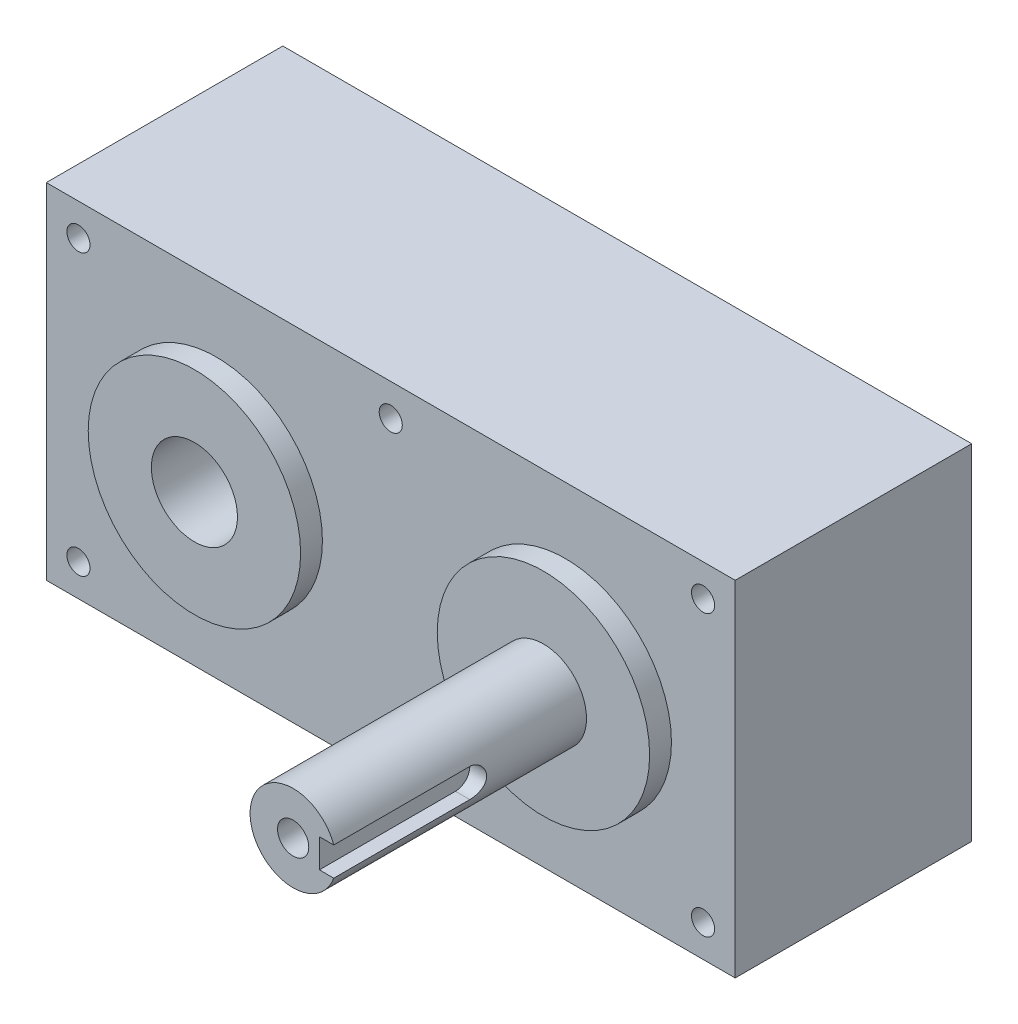
ISO-10303-21;
HEADER;
FILE_DESCRIPTION(('STEP AP214'),'2;1');
FILE_NAME('part.step','',(''),(''),'','','');
FILE_SCHEMA(('AUTOMOTIVE_DESIGN { 1 0 10303 214 1 1 1 1 }'));
ENDSEC;
DATA;
#1=APPLICATION_CONTEXT('core data for automotive mechanical design processes');
#2=APPLICATION_PROTOCOL_DEFINITION('international standard','automotive_design',2000,#1);
#3=PRODUCT_CONTEXT('',#1,'mechanical');
#4=PRODUCT('Part','Part','',(#3));
#5=PRODUCT_RELATED_PRODUCT_CATEGORY('part','',(#4));
#6=PRODUCT_DEFINITION_FORMATION('','',#4);
#7=PRODUCT_DEFINITION_CONTEXT('part definition',#1,'design');
#8=PRODUCT_DEFINITION('design','',#6,#7);
#9=PRODUCT_DEFINITION_SHAPE('','',#8);
#10=(LENGTH_UNIT() NAMED_UNIT(*) SI_UNIT(.MILLI.,.METRE.));
#11=(NAMED_UNIT(*) PLANE_ANGLE_UNIT() SI_UNIT($,.RADIAN.));
#12=(NAMED_UNIT(*) SI_UNIT($,.STERADIAN.) SOLID_ANGLE_UNIT());
#13=UNCERTAINTY_MEASURE_WITH_UNIT(LENGTH_MEASURE(1.E-05),#10,'distance_accuracy_value','');
#14=(GEOMETRIC_REPRESENTATION_CONTEXT(3) GLOBAL_UNCERTAINTY_ASSIGNED_CONTEXT((#13)) GLOBAL_UNIT_ASSIGNED_CONTEXT((#10,
#11,#12)) REPRESENTATION_CONTEXT('',''));
#15=CARTESIAN_POINT('',(0.,0.,0.));
#16=DIRECTION('',(0.,0.,1.));
#17=DIRECTION('',(1.,0.,0.));
#18=AXIS2_PLACEMENT_3D('',#15,#16,#17);
#19=CARTESIAN_POINT('',(120.613256121069,38.1,82.423));
#20=DIRECTION('',(-1.,0.,0.));
#21=DIRECTION('',(0.,-1.,0.));
#22=AXIS2_PLACEMENT_3D('',#19,#20,#21);
#23=CYLINDRICAL_SURFACE('',#22,3.175);
#24=DIRECTION('',(-1.,0.,0.));
#25=VECTOR('',#24,1.);
#26=CARTESIAN_POINT('',(120.613256121069,41.275,82.423));
#27=LINE('',#26,#25);
#28=CARTESIAN_POINT('',(120.613256121069,41.275,82.423));
#29=VERTEX_POINT('',#28);
#30=CARTESIAN_POINT('',(123.788256121069,41.275,82.423));
#31=VERTEX_POINT('',#30);
#32=EDGE_CURVE('E238',#29,#31,#27,.F.);
#33=ORIENTED_EDGE('',*,*,#32,.F.);
#34=CARTESIAN_POINT('',(120.613256121069,38.1,82.423));
#35=DIRECTION('',(-1.,0.,0.));
#36=DIRECTION('',(0.,0.,1.));
#37=AXIS2_PLACEMENT_3D('',#34,#35,#36);
#38=CIRCLE('',#37,3.175);
#39=CARTESIAN_POINT('',(120.613256121069,34.925,82.423));
#40=VERTEX_POINT('',#39);
#41=EDGE_CURVE('E45',#40,#29,#38,.F.);
#42=ORIENTED_EDGE('',*,*,#41,.F.);
#43=DIRECTION('',(-1.,0.,0.));
#44=VECTOR('',#43,1.);
#45=CARTESIAN_POINT('',(120.613256121069,34.925,82.423));
#46=LINE('',#45,#44);
#47=CARTESIAN_POINT('',(123.788256121069,34.925,82.423));
#48=VERTEX_POINT('',#47);
#49=EDGE_CURVE('E243',#48,#40,#46,.T.);
#50=ORIENTED_EDGE('',*,*,#49,.F.);
#51=CARTESIAN_POINT('',(123.788256121069,41.275,82.423));
#52=CARTESIAN_POINT('',(123.788242304569,41.2750114187021,82.3363770111682));
#53=CARTESIAN_POINT('',(123.789509137588,41.2714552677141,82.2497617451623));
#54=CARTESIAN_POINT('',(123.794501256337,41.257296781412,82.0772030812965));
#55=CARTESIAN_POINT('',(123.798225878423,41.2466963481645,81.9912595084052));
#56=CARTESIAN_POINT('',(123.808016356707,41.2185797346695,81.8209050797898));
#57=CARTESIAN_POINT('',(123.814075267596,41.2010840665918,81.7364904477605));
#58=CARTESIAN_POINT('',(123.828335272806,41.1593560990825,81.5695494988998));
#59=CARTESIAN_POINT('',(123.836536444546,41.1351235561826,81.4870232504307));
#60=CARTESIAN_POINT('',(123.863988248083,41.0526427015886,81.2432187937627));
#61=CARTESIAN_POINT('',(123.886102797327,40.9845689934899,81.0854624700145));
#62=CARTESIAN_POINT('',(123.935452332912,40.8243758581497,80.7835864494401));
#63=CARTESIAN_POINT('',(123.962690460599,40.7322416655113,80.6394752005539));
#64=CARTESIAN_POINT('',(124.020404516346,40.5226900472536,80.3633230125976));
#65=CARTESIAN_POINT('',(124.050960805736,40.4044948148077,80.2318878687051));
#66=CARTESIAN_POINT('',(124.111189759421,40.1478378041234,79.9902932788725));
#67=CARTESIAN_POINT('',(124.140862265577,40.0093724247679,79.8801376214474));
#68=CARTESIAN_POINT('',(124.196915767422,39.7116417156586,79.6814532552662));
#69=CARTESIAN_POINT('',(124.223190637862,39.5519278210567,79.5935640694678));
#70=CARTESIAN_POINT('',(124.268535077923,39.2189628313095,79.4461444060076));
#71=CARTESIAN_POINT('',(124.287606848253,39.0457158903656,79.3866052653225));
#72=CARTESIAN_POINT('',(124.315825507567,38.6969931812008,79.2996391202349));
#73=CARTESIAN_POINT('',(124.32529455999,38.5218045762153,79.2711671268605));
#74=CARTESIAN_POINT('',(124.334384567219,38.1688942262177,79.2438207349669));
#75=CARTESIAN_POINT('',(124.334007868601,37.9911730948842,79.2449392840205));
#76=CARTESIAN_POINT('',(124.323666726315,37.6456452892315,79.2760806164439));
#77=CARTESIAN_POINT('',(124.314078935449,37.4777231596305,79.3049679285731));
#78=CARTESIAN_POINT('',(124.286865996925,37.1492651051381,79.3889483527356));
#79=CARTESIAN_POINT('',(124.269240403605,36.9887295903482,79.4440429178623));
#80=CARTESIAN_POINT('',(124.227452463823,36.677115385271,79.5795380456848));
#81=CARTESIAN_POINT('',(124.203207187155,36.5261888569493,79.6602619328026));
#82=CARTESIAN_POINT('',(124.150703823057,36.2396895672522,79.844454605925));
#83=CARTESIAN_POINT('',(124.1224446448,36.1041209976522,79.947929579018));
#84=CARTESIAN_POINT('',(124.063324078611,35.8454404082646,80.1804084756018));
#85=CARTESIAN_POINT('',(124.032402811162,35.7232132308154,80.3103836293183));
#86=CARTESIAN_POINT('',(123.972558034507,35.5019883741715,80.5892406979345));
#87=CARTESIAN_POINT('',(123.943635172829,35.402998199621,80.7381286970844));
#88=CARTESIAN_POINT('',(123.890722691995,35.229781653216,81.0536014161336));
#89=CARTESIAN_POINT('',(123.86681220235,35.155942426803,81.2204149349338));
#90=CARTESIAN_POINT('',(123.837366533237,35.0673266974343,81.4786323757371));
#91=CARTESIAN_POINT('',(123.828622289333,35.0414812244401,81.566021734566));
#92=CARTESIAN_POINT('',(123.813543686305,34.9973630222442,81.7428836693226));
#93=CARTESIAN_POINT('',(123.80720822687,34.9790868351194,81.8323552742307));
#94=CARTESIAN_POINT('',(123.797590875591,34.9514947824257,82.0052052189527));
#95=CARTESIAN_POINT('',(123.794099529513,34.9415621417742,82.0884744441732));
#96=CARTESIAN_POINT('',(123.789427761841,34.9283143888059,82.2554928520594));
#97=CARTESIAN_POINT('',(123.788244358315,34.9249907373681,82.3392412750043));
#98=CARTESIAN_POINT('',(123.788256121069,34.925,82.423));
#99=B_SPLINE_CURVE_WITH_KNOTS('',3,(#51,#52,#53,#54,#55,#56,#57,#58,#59,#60,#61,#62,#63,#64,#65,
#66,#67,#68,#69,#70,#71,#72,#73,#74,#75,#76,#77,#78,#79,#80,#81,#82,#83,#84,#85,#86,#87,#88,#89,
#90,#91,#92,#93,#94,#95,#96,#97,#98),.UNSPECIFIED.,.F.,.F.,(4,2,2,2,2,2,2,2,2,2,2,2,2,2,2,2,2,2,
2,2,2,2,2,4),(0.,0.259773689035002,0.51947726358803,0.778414025374909,1.03736014626284,
1.55449291492534,2.07194378556215,2.60766387392255,3.14347925203152,3.6932798119835,
4.24291225945331,4.77342553695256,5.30381237633042,5.81339512764462,6.32300613669439,
6.839320189082,7.35577482555092,7.89650105770063,8.43740168377097,8.98628729157281,
9.26063415404912,9.53485554636032,9.78636405546807,10.0375473922007),.UNSPECIFIED.);
#100=EDGE_CURVE('E11',#48,#31,#99,.F.);
#101=ORIENTED_EDGE('',*,*,#100,.T.);
#102=EDGE_LOOP('',(#33,#42,#50,#101));
#103=FACE_BOUND('',#102,.T.);
#104=ADVANCED_FACE('F33',(#103),#23,.F.);
#105=CARTESIAN_POINT('',(114.808,38.1,57.15));
#106=DIRECTION('',(0.,0.,1.));
#107=DIRECTION('',(1.,0.,0.));
#108=AXIS2_PLACEMENT_3D('',#105,#106,#107);
#109=PLANE('',#108);
#110=CARTESIAN_POINT('',(114.808,38.1,57.15));
#111=DIRECTION('',(0.,0.,1.));
#112=DIRECTION('',(1.,0.,0.));
#113=AXIS2_PLACEMENT_3D('',#110,#111,#112);
#114=CIRCLE('',#113,23.495);
#115=CARTESIAN_POINT('',(138.303,38.1,57.15));
#116=VERTEX_POINT('',#115);
#117=EDGE_CURVE('E160',#116,#116,#114,.T.);
#118=ORIENTED_EDGE('',*,*,#117,.T.);
#119=EDGE_LOOP('',(#118));
#120=FACE_BOUND('',#119,.T.);
#121=CARTESIAN_POINT('',(114.808,38.1,57.15));
#122=DIRECTION('',(0.,0.,1.));
#123=DIRECTION('',(1.,0.,0.));
#124=AXIS2_PLACEMENT_3D('',#121,#122,#123);
#125=CIRCLE('',#124,9.52500000000001);
#126=CARTESIAN_POINT('',(124.333,38.1,57.15));
#127=VERTEX_POINT('',#126);
#128=EDGE_CURVE('E159',#127,#127,#125,.F.);
#129=ORIENTED_EDGE('',*,*,#128,.T.);
#130=EDGE_LOOP('',(#129));
#131=FACE_BOUND('',#130,.T.);
#132=ADVANCED_FACE('F265',(#120,#131),#109,.T.);
#133=CARTESIAN_POINT('',(0.,76.2,52.324));
#134=DIRECTION('',(0.,0.,-1.));
#135=DIRECTION('',(-1.,0.,0.));
#136=AXIS2_PLACEMENT_3D('',#133,#134,#135);
#137=PLANE('',#136);
#138=CARTESIAN_POINT('',(37.592,38.1,52.324));
#139=DIRECTION('',(0.,0.,-1.));
#140=DIRECTION('',(-1.,0.,0.));
#141=AXIS2_PLACEMENT_3D('',#138,#139,#140);
#142=CIRCLE('',#141,23.495);
#143=CARTESIAN_POINT('',(14.097,38.1,52.324));
#144=VERTEX_POINT('',#143);
#145=EDGE_CURVE('E232',#144,#144,#142,.F.);
#146=ORIENTED_EDGE('',*,*,#145,.F.);
#147=EDGE_LOOP('',(#146));
#148=FACE_BOUND('',#147,.T.);
#149=CARTESIAN_POINT('',(76.2,7.11199999999999,52.324));
#150=DIRECTION('',(0.,0.,1.));
#151=DIRECTION('',(1.,0.,0.));
#152=AXIS2_PLACEMENT_3D('',#149,#150,#151);
#153=CIRCLE('',#152,2.55270000000001);
#154=CARTESIAN_POINT('',(78.7527,7.11199999999999,52.324));
#155=VERTEX_POINT('',#154);
#156=EDGE_CURVE('E166',#155,#155,#153,.T.);
#157=ORIENTED_EDGE('',*,*,#156,.F.);
#158=EDGE_LOOP('',(#157));
#159=FACE_BOUND('',#158,.T.);
#160=CARTESIAN_POINT('',(7.11200000000001,7.11199999999999,52.324));
#161=DIRECTION('',(0.,0.,1.));
#162=DIRECTION('',(1.,0.,0.));
#163=AXIS2_PLACEMENT_3D('',#160,#161,#162);
#164=CIRCLE('',#163,2.5527);
#165=CARTESIAN_POINT('',(9.66470000000001,7.11199999999999,52.324));
#166=VERTEX_POINT('',#165);
#167=EDGE_CURVE('E172',#166,#166,#164,.T.);
#168=ORIENTED_EDGE('',*,*,#167,.F.);
#169=EDGE_LOOP('',(#168));
#170=FACE_BOUND('',#169,.T.);
#171=CARTESIAN_POINT('',(145.288,7.11199999999999,52.324));
#172=DIRECTION('',(0.,0.,1.));
#173=DIRECTION('',(1.,0.,0.));
#174=AXIS2_PLACEMENT_3D('',#171,#172,#173);
#175=CIRCLE('',#174,2.55269999999999);
#176=CARTESIAN_POINT('',(147.8407,7.11199999999999,52.324));
#177=VERTEX_POINT('',#176);
#178=EDGE_CURVE('E178',#177,#177,#175,.T.);
#179=ORIENTED_EDGE('',*,*,#178,.F.);
#180=EDGE_LOOP('',(#179));
#181=FACE_BOUND('',#180,.T.);
#182=CARTESIAN_POINT('',(76.2,69.088,52.324));
#183=DIRECTION('',(0.,0.,1.));
#184=DIRECTION('',(1.,0.,0.));
#185=AXIS2_PLACEMENT_3D('',#182,#183,#184);
#186=CIRCLE('',#185,2.55270000000001);
#187=CARTESIAN_POINT('',(78.7527,69.088,52.324));
#188=VERTEX_POINT('',#187);
#189=EDGE_CURVE('E184',#188,#188,#186,.T.);
#190=ORIENTED_EDGE('',*,*,#189,.F.);
#191=EDGE_LOOP('',(#190));
#192=FACE_BOUND('',#191,.T.);
#193=CARTESIAN_POINT('',(7.11200000000001,69.088,52.324));
#194=DIRECTION('',(0.,0.,1.));
#195=DIRECTION('',(1.,0.,0.));
#196=AXIS2_PLACEMENT_3D('',#193,#194,#195);
#197=CIRCLE('',#196,2.5527);
#198=CARTESIAN_POINT('',(9.66470000000001,69.088,52.324));
#199=VERTEX_POINT('',#198);
#200=EDGE_CURVE('E190',#199,#199,#197,.T.);
#201=ORIENTED_EDGE('',*,*,#200,.F.);
#202=EDGE_LOOP('',(#201));
#203=FACE_BOUND('',#202,.T.);
#204=CARTESIAN_POINT('',(145.288,69.088,52.324));
#205=DIRECTION('',(0.,0.,1.));
#206=DIRECTION('',(1.,0.,0.));
#207=AXIS2_PLACEMENT_3D('',#204,#205,#206);
#208=CIRCLE('',#207,2.55269999999999);
#209=CARTESIAN_POINT('',(147.8407,69.088,52.324));
#210=VERTEX_POINT('',#209);
#211=EDGE_CURVE('E196',#210,#210,#208,.T.);
#212=ORIENTED_EDGE('',*,*,#211,.F.);
#213=EDGE_LOOP('',(#212));
#214=FACE_BOUND('',#213,.T.);
#215=DIRECTION('',(0.,-1.,0.));
#216=VECTOR('',#215,1.);
#217=CARTESIAN_POINT('',(0.,0.,52.324));
#218=LINE('',#217,#216);
#219=CARTESIAN_POINT('',(0.,76.2,52.324));
#220=VERTEX_POINT('',#219);
#221=CARTESIAN_POINT('',(0.,0.,52.324));
#222=VERTEX_POINT('',#221);
#223=EDGE_CURVE('E203',#220,#222,#218,.T.);
#224=ORIENTED_EDGE('',*,*,#223,.T.);
#225=DIRECTION('',(1.,0.,0.));
#226=VECTOR('',#225,1.);
#227=CARTESIAN_POINT('',(0.,0.,52.324));
#228=LINE('',#227,#226);
#229=CARTESIAN_POINT('',(152.4,0.,52.324));
#230=VERTEX_POINT('',#229);
#231=EDGE_CURVE('E206',#222,#230,#228,.T.);
#232=ORIENTED_EDGE('',*,*,#231,.T.);
#233=DIRECTION('',(0.,1.,0.));
#234=VECTOR('',#233,1.);
#235=CARTESIAN_POINT('',(152.4,0.,52.324));
#236=LINE('',#235,#234);
#237=CARTESIAN_POINT('',(152.4,76.2,52.324));
#238=VERTEX_POINT('',#237);
#239=EDGE_CURVE('E209',#230,#238,#236,.T.);
#240=ORIENTED_EDGE('',*,*,#239,.T.);
#241=DIRECTION('',(-1.,0.,0.));
#242=VECTOR('',#241,1.);
#243=CARTESIAN_POINT('',(0.,76.2,52.324));
#244=LINE('',#243,#242);
#245=EDGE_CURVE('E211',#238,#220,#244,.T.);
#246=ORIENTED_EDGE('',*,*,#245,.T.);
#247=EDGE_LOOP('',(#224,#232,#240,#246));
#248=FACE_BOUND('',#247,.T.);
#249=CARTESIAN_POINT('',(114.808,38.1,52.324));
#250=DIRECTION('',(0.,0.,-1.));
#251=DIRECTION('',(-1.,0.,0.));
#252=AXIS2_PLACEMENT_3D('',#249,#250,#251);
#253=CIRCLE('',#252,23.495);
#254=CARTESIAN_POINT('',(91.313,38.1,52.324));
#255=VERTEX_POINT('',#254);
#256=EDGE_CURVE('E235',#255,#255,#253,.F.);
#257=ORIENTED_EDGE('',*,*,#256,.F.);
#258=EDGE_LOOP('',(#257));
#259=FACE_BOUND('',#258,.T.);
#260=ADVANCED_FACE('F267',(#148,#159,#170,#181,#192,#203,#214,#248,#259),#137,.F.);
#261=CARTESIAN_POINT('',(0.,0.,52.324));
#262=DIRECTION('',(1.,0.,0.));
#263=DIRECTION('',(0.,0.,-1.));
#264=AXIS2_PLACEMENT_3D('',#261,#262,#263);
#265=PLANE('',#264);
#266=DIRECTION('',(0.,-1.,0.));
#267=VECTOR('',#266,1.);
#268=CARTESIAN_POINT('',(0.,0.,0.));
#269=LINE('',#268,#267);
#270=CARTESIAN_POINT('',(0.,76.2,0.));
#271=VERTEX_POINT('',#270);
#272=CARTESIAN_POINT('',(0.,0.,0.));
#273=VERTEX_POINT('',#272);
#274=EDGE_CURVE('E202',#271,#273,#269,.T.);
#275=ORIENTED_EDGE('',*,*,#274,.T.);
#276=DIRECTION('',(0.,0.,-1.));
#277=VECTOR('',#276,1.);
#278=CARTESIAN_POINT('',(0.,0.,52.324));
#279=LINE('',#278,#277);
#280=EDGE_CURVE('E229',#222,#273,#279,.T.);
#281=ORIENTED_EDGE('',*,*,#280,.F.);
#282=ORIENTED_EDGE('',*,*,#223,.F.);
#283=DIRECTION('',(0.,0.,-1.));
#284=VECTOR('',#283,1.);
#285=CARTESIAN_POINT('',(0.,76.2,52.324));
#286=LINE('',#285,#284);
#287=EDGE_CURVE('E213',#220,#271,#286,.T.);
#288=ORIENTED_EDGE('',*,*,#287,.T.);
#289=EDGE_LOOP('',(#275,#281,#282,#288));
#290=FACE_BOUND('',#289,.T.);
#291=ADVANCED_FACE('F274',(#290),#265,.F.);
#292=CARTESIAN_POINT('',(0.,0.,52.324));
#293=DIRECTION('',(0.,1.,0.));
#294=DIRECTION('',(0.,0.,1.));
#295=AXIS2_PLACEMENT_3D('',#292,#293,#294);
#296=PLANE('',#295);
#297=DIRECTION('',(1.,0.,0.));
#298=VECTOR('',#297,1.);
#299=CARTESIAN_POINT('',(0.,0.,0.));
#300=LINE('',#299,#298);
#301=CARTESIAN_POINT('',(152.4,0.,0.));
#302=VERTEX_POINT('',#301);
#303=EDGE_CURVE('E216',#273,#302,#300,.T.);
#304=ORIENTED_EDGE('',*,*,#303,.T.);
#305=DIRECTION('',(0.,0.,-1.));
#306=VECTOR('',#305,1.);
#307=CARTESIAN_POINT('',(152.4,0.,52.324));
#308=LINE('',#307,#306);
#309=EDGE_CURVE('E226',#230,#302,#308,.T.);
#310=ORIENTED_EDGE('',*,*,#309,.F.);
#311=ORIENTED_EDGE('',*,*,#231,.F.);
#312=ORIENTED_EDGE('',*,*,#280,.T.);
#313=EDGE_LOOP('',(#304,#310,#311,#312));
#314=FACE_BOUND('',#313,.T.);
#315=ADVANCED_FACE('F350',(#314),#296,.F.);
#316=CARTESIAN_POINT('',(152.4,0.,52.324));
#317=DIRECTION('',(-1.,0.,0.));
#318=DIRECTION('',(0.,0.,1.));
#319=AXIS2_PLACEMENT_3D('',#316,#317,#318);
#320=PLANE('',#319);
#321=DIRECTION('',(0.,1.,0.));
#322=VECTOR('',#321,1.);
#323=CARTESIAN_POINT('',(152.4,0.,0.));
#324=LINE('',#323,#322);
#325=CARTESIAN_POINT('',(152.4,76.2,0.));
#326=VERTEX_POINT('',#325);
#327=EDGE_CURVE('E218',#302,#326,#324,.T.);
#328=ORIENTED_EDGE('',*,*,#327,.T.);
#329=DIRECTION('',(0.,0.,-1.));
#330=VECTOR('',#329,1.);
#331=CARTESIAN_POINT('',(152.4,76.2,52.324));
#332=LINE('',#331,#330);
#333=EDGE_CURVE('E223',#238,#326,#332,.T.);
#334=ORIENTED_EDGE('',*,*,#333,.F.);
#335=ORIENTED_EDGE('',*,*,#239,.F.);
#336=ORIENTED_EDGE('',*,*,#309,.T.);
#337=EDGE_LOOP('',(#328,#334,#335,#336));
#338=FACE_BOUND('',#337,.T.);
#339=ADVANCED_FACE('F346',(#338),#320,.F.);
#340=CARTESIAN_POINT('',(0.,76.2,52.324));
#341=DIRECTION('',(0.,-1.,0.));
#342=DIRECTION('',(0.,0.,-1.));
#343=AXIS2_PLACEMENT_3D('',#340,#341,#342);
#344=PLANE('',#343);
#345=DIRECTION('',(-1.,0.,0.));
#346=VECTOR('',#345,1.);
#347=CARTESIAN_POINT('',(0.,76.2,0.));
#348=LINE('',#347,#346);
#349=EDGE_CURVE('E207',#326,#271,#348,.T.);
#350=ORIENTED_EDGE('',*,*,#349,.T.);
#351=ORIENTED_EDGE('',*,*,#287,.F.);
#352=ORIENTED_EDGE('',*,*,#245,.F.);
#353=ORIENTED_EDGE('',*,*,#333,.T.);
#354=EDGE_LOOP('',(#350,#351,#352,#353));
#355=FACE_BOUND('',#354,.T.);
#356=ADVANCED_FACE('F342',(#355),#344,.F.);
#357=CARTESIAN_POINT('',(0.,76.2,0.));
#358=DIRECTION('',(0.,0.,-1.));
#359=DIRECTION('',(-1.,0.,0.));
#360=AXIS2_PLACEMENT_3D('',#357,#358,#359);
#361=PLANE('',#360);
#362=CARTESIAN_POINT('',(37.592,38.1,0.));
#363=DIRECTION('',(0.,0.,1.));
#364=DIRECTION('',(1.,0.,0.));
#365=AXIS2_PLACEMENT_3D('',#362,#363,#364);
#366=CIRCLE('',#365,9.525);
#367=CARTESIAN_POINT('',(47.117,38.1,0.));
#368=VERTEX_POINT('',#367);
#369=EDGE_CURVE('E132',#368,#368,#366,.T.);
#370=ORIENTED_EDGE('',*,*,#369,.T.);
#371=EDGE_LOOP('',(#370));
#372=FACE_BOUND('',#371,.T.);
#373=ORIENTED_EDGE('',*,*,#274,.F.);
#374=ORIENTED_EDGE('',*,*,#349,.F.);
#375=ORIENTED_EDGE('',*,*,#327,.F.);
#376=ORIENTED_EDGE('',*,*,#303,.F.);
#377=EDGE_LOOP('',(#373,#374,#375,#376));
#378=FACE_BOUND('',#377,.T.);
#379=ADVANCED_FACE('F337',(#372,#378),#361,.T.);
#380=CARTESIAN_POINT('',(145.288,69.088,35.814));
#381=DIRECTION('',(0.,0.,1.));
#382=DIRECTION('',(1.,0.,0.));
#383=AXIS2_PLACEMENT_3D('',#380,#381,#382);
#384=CONICAL_SURFACE('',#383,2.55269999999999,1.02974425867665);
#385=CARTESIAN_POINT('',(145.288,69.088,34.2801830978083));
#386=VERTEX_POINT('',#385);
#387=VERTEX_LOOP('',#386);
#388=FACE_BOUND('',#387,.T.);
#389=CARTESIAN_POINT('',(145.288,69.088,35.814));
#390=DIRECTION('',(0.,0.,1.));
#391=DIRECTION('',(1.,0.,0.));
#392=AXIS2_PLACEMENT_3D('',#389,#390,#391);
#393=CIRCLE('',#392,2.55269999999999);
#394=CARTESIAN_POINT('',(147.8407,69.088,35.814));
#395=VERTEX_POINT('',#394);
#396=EDGE_CURVE('E199',#395,#395,#393,.T.);
#397=ORIENTED_EDGE('',*,*,#396,.T.);
#398=EDGE_LOOP('',(#397));
#399=FACE_BOUND('',#398,.T.);
#400=ADVANCED_FACE('F334',(#388,#399),#384,.F.);
#401=CARTESIAN_POINT('',(145.288,69.088,52.324));
#402=DIRECTION('',(0.,0.,1.));
#403=DIRECTION('',(1.,0.,0.));
#404=AXIS2_PLACEMENT_3D('',#401,#402,#403);
#405=CYLINDRICAL_SURFACE('',#404,2.55269999999999);
#406=ORIENTED_EDGE('',*,*,#396,.F.);
#407=EDGE_LOOP('',(#406));
#408=FACE_BOUND('',#407,.T.);
#409=ORIENTED_EDGE('',*,*,#211,.T.);
#410=EDGE_LOOP('',(#409));
#411=FACE_BOUND('',#410,.T.);
#412=ADVANCED_FACE('F330',(#408,#411),#405,.F.);
#413=CARTESIAN_POINT('',(7.11200000000001,69.088,35.814));
#414=DIRECTION('',(0.,0.,1.));
#415=DIRECTION('',(1.,0.,0.));
#416=AXIS2_PLACEMENT_3D('',#413,#414,#415);
#417=CONICAL_SURFACE('',#416,2.5527,1.02974425867665);
#418=CARTESIAN_POINT('',(7.112,69.088,34.2801830978083));
#419=VERTEX_POINT('',#418);
#420=VERTEX_LOOP('',#419);
#421=FACE_BOUND('',#420,.T.);
#422=CARTESIAN_POINT('',(7.11200000000001,69.088,35.814));
#423=DIRECTION('',(0.,0.,1.));
#424=DIRECTION('',(1.,0.,0.));
#425=AXIS2_PLACEMENT_3D('',#422,#423,#424);
#426=CIRCLE('',#425,2.5527);
#427=CARTESIAN_POINT('',(9.6647,69.088,35.814));
#428=VERTEX_POINT('',#427);
#429=EDGE_CURVE('E193',#428,#428,#426,.T.);
#430=ORIENTED_EDGE('',*,*,#429,.T.);
#431=EDGE_LOOP('',(#430));
#432=FACE_BOUND('',#431,.T.);
#433=ADVANCED_FACE('F326',(#421,#432),#417,.F.);
#434=CARTESIAN_POINT('',(7.11200000000001,69.088,52.324));
#435=DIRECTION('',(0.,0.,1.));
#436=DIRECTION('',(1.,0.,0.));
#437=AXIS2_PLACEMENT_3D('',#434,#435,#436);
#438=CYLINDRICAL_SURFACE('',#437,2.5527);
#439=ORIENTED_EDGE('',*,*,#429,.F.);
#440=EDGE_LOOP('',(#439));
#441=FACE_BOUND('',#440,.T.);
#442=ORIENTED_EDGE('',*,*,#200,.T.);
#443=EDGE_LOOP('',(#442));
#444=FACE_BOUND('',#443,.T.);
#445=ADVANCED_FACE('F322',(#441,#444),#438,.F.);
#446=CARTESIAN_POINT('',(76.2,69.088,35.814));
#447=DIRECTION('',(0.,0.,1.));
#448=DIRECTION('',(1.,0.,0.));
#449=AXIS2_PLACEMENT_3D('',#446,#447,#448);
#450=CONICAL_SURFACE('',#449,2.55269999999999,1.02974425867665);
#451=CARTESIAN_POINT('',(76.2,69.088,34.2801830978083));
#452=VERTEX_POINT('',#451);
#453=VERTEX_LOOP('',#452);
#454=FACE_BOUND('',#453,.T.);
#455=CARTESIAN_POINT('',(76.2,69.088,35.814));
#456=DIRECTION('',(0.,0.,1.));
#457=DIRECTION('',(1.,0.,0.));
#458=AXIS2_PLACEMENT_3D('',#455,#456,#457);
#459=CIRCLE('',#458,2.55269999999999);
#460=CARTESIAN_POINT('',(78.7527,69.088,35.814));
#461=VERTEX_POINT('',#460);
#462=EDGE_CURVE('E187',#461,#461,#459,.T.);
#463=ORIENTED_EDGE('',*,*,#462,.T.);
#464=EDGE_LOOP('',(#463));
#465=FACE_BOUND('',#464,.T.);
#466=ADVANCED_FACE('F318',(#454,#465),#450,.F.);
#467=CARTESIAN_POINT('',(76.2,69.088,52.324));
#468=DIRECTION('',(0.,0.,1.));
#469=DIRECTION('',(1.,0.,0.));
#470=AXIS2_PLACEMENT_3D('',#467,#468,#469);
#471=CYLINDRICAL_SURFACE('',#470,2.5527);
#472=ORIENTED_EDGE('',*,*,#462,.F.);
#473=EDGE_LOOP('',(#472));
#474=FACE_BOUND('',#473,.T.);
#475=ORIENTED_EDGE('',*,*,#189,.T.);
#476=EDGE_LOOP('',(#475));
#477=FACE_BOUND('',#476,.T.);
#478=ADVANCED_FACE('F314',(#474,#477),#471,.F.);
#479=CARTESIAN_POINT('',(145.288,7.11199999999999,35.814));
#480=DIRECTION('',(0.,0.,1.));
#481=DIRECTION('',(1.,0.,0.));
#482=AXIS2_PLACEMENT_3D('',#479,#480,#481);
#483=CONICAL_SURFACE('',#482,2.55269999999999,1.02974425867665);
#484=CARTESIAN_POINT('',(145.288,7.11199999999999,34.2801830978083));
#485=VERTEX_POINT('',#484);
#486=VERTEX_LOOP('',#485);
#487=FACE_BOUND('',#486,.T.);
#488=CARTESIAN_POINT('',(145.288,7.11199999999999,35.814));
#489=DIRECTION('',(0.,0.,1.));
#490=DIRECTION('',(1.,0.,0.));
#491=AXIS2_PLACEMENT_3D('',#488,#489,#490);
#492=CIRCLE('',#491,2.55269999999999);
#493=CARTESIAN_POINT('',(147.8407,7.11199999999999,35.814));
#494=VERTEX_POINT('',#493);
#495=EDGE_CURVE('E181',#494,#494,#492,.T.);
#496=ORIENTED_EDGE('',*,*,#495,.T.);
#497=EDGE_LOOP('',(#496));
#498=FACE_BOUND('',#497,.T.);
#499=ADVANCED_FACE('F310',(#487,#498),#483,.F.);
#500=CARTESIAN_POINT('',(145.288,7.11199999999999,52.324));
#501=DIRECTION('',(0.,0.,1.));
#502=DIRECTION('',(1.,0.,0.));
#503=AXIS2_PLACEMENT_3D('',#500,#501,#502);
#504=CYLINDRICAL_SURFACE('',#503,2.55269999999999);
#505=ORIENTED_EDGE('',*,*,#495,.F.);
#506=EDGE_LOOP('',(#505));
#507=FACE_BOUND('',#506,.T.);
#508=ORIENTED_EDGE('',*,*,#178,.T.);
#509=EDGE_LOOP('',(#508));
#510=FACE_BOUND('',#509,.T.);
#511=ADVANCED_FACE('F306',(#507,#510),#504,.F.);
#512=CARTESIAN_POINT('',(7.11200000000001,7.11199999999999,35.814));
#513=DIRECTION('',(0.,0.,1.));
#514=DIRECTION('',(1.,0.,0.));
#515=AXIS2_PLACEMENT_3D('',#512,#513,#514);
#516=CONICAL_SURFACE('',#515,2.5527,1.02974425867665);
#517=CARTESIAN_POINT('',(7.112,7.11199999999999,34.2801830978083));
#518=VERTEX_POINT('',#517);
#519=VERTEX_LOOP('',#518);
#520=FACE_BOUND('',#519,.T.);
#521=CARTESIAN_POINT('',(7.11200000000001,7.11199999999999,35.814));
#522=DIRECTION('',(0.,0.,1.));
#523=DIRECTION('',(1.,0.,0.));
#524=AXIS2_PLACEMENT_3D('',#521,#522,#523);
#525=CIRCLE('',#524,2.5527);
#526=CARTESIAN_POINT('',(9.6647,7.11199999999999,35.814));
#527=VERTEX_POINT('',#526);
#528=EDGE_CURVE('E175',#527,#527,#525,.T.);
#529=ORIENTED_EDGE('',*,*,#528,.T.);
#530=EDGE_LOOP('',(#529));
#531=FACE_BOUND('',#530,.T.);
#532=ADVANCED_FACE('F302',(#520,#531),#516,.F.);
#533=CARTESIAN_POINT('',(7.11200000000001,7.11199999999999,52.324));
#534=DIRECTION('',(0.,0.,1.));
#535=DIRECTION('',(1.,0.,0.));
#536=AXIS2_PLACEMENT_3D('',#533,#534,#535);
#537=CYLINDRICAL_SURFACE('',#536,2.5527);
#538=ORIENTED_EDGE('',*,*,#528,.F.);
#539=EDGE_LOOP('',(#538));
#540=FACE_BOUND('',#539,.T.);
#541=ORIENTED_EDGE('',*,*,#167,.T.);
#542=EDGE_LOOP('',(#541));
#543=FACE_BOUND('',#542,.T.);
#544=ADVANCED_FACE('F298',(#540,#543),#537,.F.);
#545=CARTESIAN_POINT('',(76.2,7.11199999999999,35.814));
#546=DIRECTION('',(0.,0.,1.));
#547=DIRECTION('',(1.,0.,0.));
#548=AXIS2_PLACEMENT_3D('',#545,#546,#547);
#549=CONICAL_SURFACE('',#548,2.55269999999999,1.02974425867665);
#550=CARTESIAN_POINT('',(76.2,7.11199999999999,34.2801830978083));
#551=VERTEX_POINT('',#550);
#552=VERTEX_LOOP('',#551);
#553=FACE_BOUND('',#552,.T.);
#554=CARTESIAN_POINT('',(76.2,7.11199999999999,35.814));
#555=DIRECTION('',(0.,0.,1.));
#556=DIRECTION('',(1.,0.,0.));
#557=AXIS2_PLACEMENT_3D('',#554,#555,#556);
#558=CIRCLE('',#557,2.55269999999999);
#559=CARTESIAN_POINT('',(78.7527,7.11199999999999,35.814));
#560=VERTEX_POINT('',#559);
#561=EDGE_CURVE('E169',#560,#560,#558,.T.);
#562=ORIENTED_EDGE('',*,*,#561,.T.);
#563=EDGE_LOOP('',(#562));
#564=FACE_BOUND('',#563,.T.);
#565=ADVANCED_FACE('F294',(#553,#564),#549,.F.);
#566=CARTESIAN_POINT('',(76.2,7.11199999999999,52.324));
#567=DIRECTION('',(0.,0.,1.));
#568=DIRECTION('',(1.,0.,0.));
#569=AXIS2_PLACEMENT_3D('',#566,#567,#568);
#570=CYLINDRICAL_SURFACE('',#569,2.5527);
#571=ORIENTED_EDGE('',*,*,#561,.F.);
#572=EDGE_LOOP('',(#571));
#573=FACE_BOUND('',#572,.T.);
#574=ORIENTED_EDGE('',*,*,#156,.T.);
#575=EDGE_LOOP('',(#574));
#576=FACE_BOUND('',#575,.T.);
#577=ADVANCED_FACE('F290',(#573,#576),#570,.F.);
#578=CARTESIAN_POINT('',(37.592,38.1,57.15));
#579=DIRECTION('',(0.,0.,-1.));
#580=DIRECTION('',(-1.,0.,0.));
#581=AXIS2_PLACEMENT_3D('',#578,#579,#580);
#582=CYLINDRICAL_SURFACE('',#581,23.495);
#583=CARTESIAN_POINT('',(37.592,38.1,57.15));
#584=DIRECTION('',(0.,0.,1.));
#585=DIRECTION('',(1.,0.,0.));
#586=AXIS2_PLACEMENT_3D('',#583,#584,#585);
#587=CIRCLE('',#586,23.495);
#588=CARTESIAN_POINT('',(61.087,38.1,57.15));
#589=VERTEX_POINT('',#588);
#590=EDGE_CURVE('E163',#589,#589,#587,.T.);
#591=ORIENTED_EDGE('',*,*,#590,.F.);
#592=EDGE_LOOP('',(#591));
#593=FACE_BOUND('',#592,.T.);
#594=ORIENTED_EDGE('',*,*,#145,.T.);
#595=EDGE_LOOP('',(#594));
#596=FACE_BOUND('',#595,.T.);
#597=ADVANCED_FACE('F286',(#593,#596),#582,.T.);
#598=CARTESIAN_POINT('',(37.592,38.1,57.15));
#599=DIRECTION('',(0.,0.,1.));
#600=DIRECTION('',(1.,0.,0.));
#601=AXIS2_PLACEMENT_3D('',#598,#599,#600);
#602=PLANE('',#601);
#603=CARTESIAN_POINT('',(37.592,38.1,57.15));
#604=DIRECTION('',(0.,0.,1.));
#605=DIRECTION('',(1.,0.,0.));
#606=AXIS2_PLACEMENT_3D('',#603,#604,#605);
#607=CIRCLE('',#606,9.525);
#608=CARTESIAN_POINT('',(47.117,38.1,57.15));
#609=VERTEX_POINT('',#608);
#610=EDGE_CURVE('E128',#609,#609,#607,.T.);
#611=ORIENTED_EDGE('',*,*,#610,.F.);
#612=EDGE_LOOP('',(#611));
#613=FACE_BOUND('',#612,.T.);
#614=ORIENTED_EDGE('',*,*,#590,.T.);
#615=EDGE_LOOP('',(#614));
#616=FACE_BOUND('',#615,.T.);
#617=ADVANCED_FACE('F282',(#613,#616),#602,.T.);
#618=CARTESIAN_POINT('',(114.808,38.1,57.15));
#619=DIRECTION('',(0.,0.,-1.));
#620=DIRECTION('',(-1.,0.,0.));
#621=AXIS2_PLACEMENT_3D('',#618,#619,#620);
#622=CYLINDRICAL_SURFACE('',#621,23.495);
#623=ORIENTED_EDGE('',*,*,#117,.F.);
#624=EDGE_LOOP('',(#623));
#625=FACE_BOUND('',#624,.T.);
#626=ORIENTED_EDGE('',*,*,#256,.T.);
#627=EDGE_LOOP('',(#626));
#628=FACE_BOUND('',#627,.T.);
#629=ADVANCED_FACE('F262',(#625,#628),#622,.T.);
#630=CARTESIAN_POINT('',(114.808,38.1,112.522));
#631=DIRECTION('',(0.,0.,-1.));
#632=DIRECTION('',(-1.,0.,0.));
#633=AXIS2_PLACEMENT_3D('',#630,#631,#632);
#634=CYLINDRICAL_SURFACE('',#633,9.52500000000001);
#635=ORIENTED_EDGE('',*,*,#100,.F.);
#636=DIRECTION('',(0.,0.,1.));
#637=VECTOR('',#636,1.);
#638=CARTESIAN_POINT('',(123.788256121069,34.925,79.248));
#639=LINE('',#638,#637);
#640=CARTESIAN_POINT('',(123.788256121069,34.925,112.522));
#641=VERTEX_POINT('',#640);
#642=EDGE_CURVE('E152',#48,#641,#639,.T.);
#643=ORIENTED_EDGE('',*,*,#642,.T.);
#644=CARTESIAN_POINT('',(114.808,38.1,112.522));
#645=DIRECTION('',(0.,0.,1.));
#646=DIRECTION('',(1.,0.,0.));
#647=AXIS2_PLACEMENT_3D('',#644,#645,#646);
#648=CIRCLE('',#647,9.52500000000001);
#649=CARTESIAN_POINT('',(123.788256121069,41.275,112.522));
#650=VERTEX_POINT('',#649);
#651=EDGE_CURVE('E151',#650,#641,#648,.T.);
#652=ORIENTED_EDGE('',*,*,#651,.F.);
#653=DIRECTION('',(0.,0.,1.));
#654=VECTOR('',#653,1.);
#655=CARTESIAN_POINT('',(123.788256121069,41.275,79.248));
#656=LINE('',#655,#654);
#657=EDGE_CURVE('E149',#31,#650,#656,.T.);
#658=ORIENTED_EDGE('',*,*,#657,.F.);
#659=EDGE_LOOP('',(#635,#643,#652,#658));
#660=FACE_BOUND('',#659,.T.);
#661=ORIENTED_EDGE('',*,*,#128,.F.);
#662=EDGE_LOOP('',(#661));
#663=FACE_BOUND('',#662,.T.);
#664=ADVANCED_FACE('F259',(#660,#663),#634,.T.);
#665=CARTESIAN_POINT('',(114.808,38.1,112.522));
#666=DIRECTION('',(0.,0.,1.));
#667=DIRECTION('',(1.,0.,0.));
#668=AXIS2_PLACEMENT_3D('',#665,#666,#667);
#669=PLANE('',#668);
#670=CARTESIAN_POINT('',(114.808,38.1,112.522));
#671=DIRECTION('',(0.,0.,1.));
#672=DIRECTION('',(1.,0.,0.));
#673=AXIS2_PLACEMENT_3D('',#670,#671,#672);
#674=CIRCLE('',#673,3.4544);
#675=CARTESIAN_POINT('',(118.2624,38.1,112.522));
#676=VERTEX_POINT('',#675);
#677=EDGE_CURVE('E129',#676,#676,#674,.T.);
#678=ORIENTED_EDGE('',*,*,#677,.F.);
#679=EDGE_LOOP('',(#678));
#680=FACE_BOUND('',#679,.T.);
#681=DIRECTION('',(-1.,0.,0.));
#682=VECTOR('',#681,1.);
#683=CARTESIAN_POINT('',(120.613256121069,41.275,112.522));
#684=LINE('',#683,#682);
#685=CARTESIAN_POINT('',(120.613256121069,41.275,112.522));
#686=VERTEX_POINT('',#685);
#687=EDGE_CURVE('E138',#650,#686,#684,.T.);
#688=ORIENTED_EDGE('',*,*,#687,.F.);
#689=ORIENTED_EDGE('',*,*,#651,.T.);
#690=DIRECTION('',(1.,0.,0.));
#691=VECTOR('',#690,1.);
#692=CARTESIAN_POINT('',(120.613256121069,34.925,112.522));
#693=LINE('',#692,#691);
#694=CARTESIAN_POINT('',(120.613256121069,34.925,112.522));
#695=VERTEX_POINT('',#694);
#696=EDGE_CURVE('E145',#695,#641,#693,.T.);
#697=ORIENTED_EDGE('',*,*,#696,.F.);
#698=DIRECTION('',(0.,-1.,0.));
#699=VECTOR('',#698,1.);
#700=CARTESIAN_POINT('',(120.613256121069,34.925,112.522));
#701=LINE('',#700,#699);
#702=EDGE_CURVE('E142',#686,#695,#701,.T.);
#703=ORIENTED_EDGE('',*,*,#702,.F.);
#704=EDGE_LOOP('',(#688,#689,#697,#703));
#705=FACE_BOUND('',#704,.T.);
#706=ADVANCED_FACE('F255',(#680,#705),#669,.T.);
#707=CARTESIAN_POINT('',(120.613256121069,41.275,79.248));
#708=DIRECTION('',(0.,1.,0.));
#709=DIRECTION('',(-1.,0.,0.));
#710=AXIS2_PLACEMENT_3D('',#707,#708,#709);
#711=PLANE('',#710);
#712=DIRECTION('',(0.,0.,1.));
#713=VECTOR('',#712,1.);
#714=CARTESIAN_POINT('',(120.613256121069,41.275,79.248));
#715=LINE('',#714,#713);
#716=EDGE_CURVE('E148',#29,#686,#715,.T.);
#717=ORIENTED_EDGE('',*,*,#716,.F.);
#718=ORIENTED_EDGE('',*,*,#32,.T.);
#719=ORIENTED_EDGE('',*,*,#657,.T.);
#720=ORIENTED_EDGE('',*,*,#687,.T.);
#721=EDGE_LOOP('',(#717,#718,#719,#720));
#722=FACE_BOUND('',#721,.T.);
#723=ADVANCED_FACE('F249',(#722),#711,.F.);
#724=CARTESIAN_POINT('',(120.613256121069,34.925,79.248));
#725=DIRECTION('',(0.,-1.,0.));
#726=DIRECTION('',(0.,0.,-1.));
#727=AXIS2_PLACEMENT_3D('',#724,#725,#726);
#728=PLANE('',#727);
#729=ORIENTED_EDGE('',*,*,#642,.F.);
#730=ORIENTED_EDGE('',*,*,#49,.T.);
#731=DIRECTION('',(0.,0.,1.));
#732=VECTOR('',#731,1.);
#733=CARTESIAN_POINT('',(120.613256121069,34.925,79.248));
#734=LINE('',#733,#732);
#735=EDGE_CURVE('E154',#40,#695,#734,.T.);
#736=ORIENTED_EDGE('',*,*,#735,.T.);
#737=ORIENTED_EDGE('',*,*,#696,.T.);
#738=EDGE_LOOP('',(#729,#730,#736,#737));
#739=FACE_BOUND('',#738,.T.);
#740=ADVANCED_FACE('F258',(#739),#728,.F.);
#741=CARTESIAN_POINT('',(120.613256121069,34.925,79.248));
#742=DIRECTION('',(-1.,0.,0.));
#743=DIRECTION('',(0.,0.,1.));
#744=AXIS2_PLACEMENT_3D('',#741,#742,#743);
#745=PLANE('',#744);
#746=ORIENTED_EDGE('',*,*,#735,.F.);
#747=ORIENTED_EDGE('',*,*,#41,.T.);
#748=ORIENTED_EDGE('',*,*,#716,.T.);
#749=ORIENTED_EDGE('',*,*,#702,.T.);
#750=EDGE_LOOP('',(#746,#747,#748,#749));
#751=FACE_BOUND('',#750,.T.);
#752=ADVANCED_FACE('F246',(#751),#745,.F.);
#753=CARTESIAN_POINT('',(37.592,38.1,0.));
#754=DIRECTION('',(0.,0.,1.));
#755=DIRECTION('',(1.,0.,0.));
#756=AXIS2_PLACEMENT_3D('',#753,#754,#755);
#757=CYLINDRICAL_SURFACE('',#756,9.525);
#758=ORIENTED_EDGE('',*,*,#369,.F.);
#759=EDGE_LOOP('',(#758));
#760=FACE_BOUND('',#759,.T.);
#761=ORIENTED_EDGE('',*,*,#610,.T.);
#762=EDGE_LOOP('',(#761));
#763=FACE_BOUND('',#762,.T.);
#764=ADVANCED_FACE('F122',(#760,#763),#757,.F.);
#765=CARTESIAN_POINT('',(114.808,38.1,93.462));
#766=DIRECTION('',(0.,0.,1.));
#767=DIRECTION('',(1.,0.,0.));
#768=AXIS2_PLACEMENT_3D('',#765,#766,#767);
#769=CONICAL_SURFACE('',#768,3.4544,1.02974425867665);
#770=CARTESIAN_POINT('',(114.808,38.1,91.3863870776312));
#771=VERTEX_POINT('',#770);
#772=VERTEX_LOOP('',#771);
#773=FACE_BOUND('',#772,.T.);
#774=CARTESIAN_POINT('',(114.808,38.1,93.462));
#775=DIRECTION('',(0.,0.,1.));
#776=DIRECTION('',(1.,0.,0.));
#777=AXIS2_PLACEMENT_3D('',#774,#775,#776);
#778=CIRCLE('',#777,3.4544);
#779=CARTESIAN_POINT('',(118.2624,38.1,93.462));
#780=VERTEX_POINT('',#779);
#781=EDGE_CURVE('E126',#780,#780,#778,.T.);
#782=ORIENTED_EDGE('',*,*,#781,.T.);
#783=EDGE_LOOP('',(#782));
#784=FACE_BOUND('',#783,.T.);
#785=ADVANCED_FACE('F118',(#773,#784),#769,.F.);
#786=CARTESIAN_POINT('',(114.808,38.1,112.522));
#787=DIRECTION('',(0.,0.,1.));
#788=DIRECTION('',(1.,0.,0.));
#789=AXIS2_PLACEMENT_3D('',#786,#787,#788);
#790=CYLINDRICAL_SURFACE('',#789,3.4544);
#791=ORIENTED_EDGE('',*,*,#781,.F.);
#792=EDGE_LOOP('',(#791));
#793=FACE_BOUND('',#792,.T.);
#794=ORIENTED_EDGE('',*,*,#677,.T.);
#795=EDGE_LOOP('',(#794));
#796=FACE_BOUND('',#795,.T.);
#797=ADVANCED_FACE('F121',(#793,#796),#790,.F.);
#798=CLOSED_SHELL('',(#104,#132,#260,#291,#315,#339,#356,#379,#400,#412,#433,#445,#466,#478,
#499,#511,#532,#544,#565,#577,#597,#617,#629,#664,#706,#723,#740,#752,#764,#785,#797));
#799=MANIFOLD_SOLID_BREP('B2',#798);
#800=ADVANCED_BREP_SHAPE_REPRESENTATION('',(#18,#799),#14);
#801=SHAPE_DEFINITION_REPRESENTATION(#9,#800);
ENDSEC;
END-ISO-10303-21;
